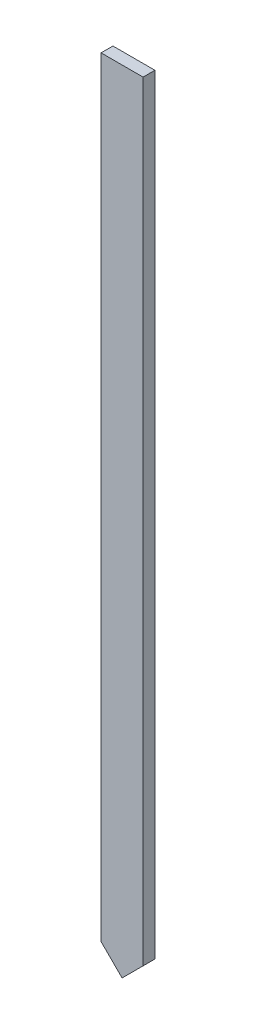
ISO-10303-21;
HEADER;
FILE_DESCRIPTION(('STEP AP214'),'2;1');
FILE_NAME('part.step','',(''),(''),'','','');
FILE_SCHEMA(('AUTOMOTIVE_DESIGN { 1 0 10303 214 1 1 1 1 }'));
ENDSEC;
DATA;
#1=APPLICATION_CONTEXT('core data for automotive mechanical design processes');
#2=APPLICATION_PROTOCOL_DEFINITION('international standard','automotive_design',2000,#1);
#3=PRODUCT_CONTEXT('',#1,'mechanical');
#4=PRODUCT('Part','Part','',(#3));
#5=PRODUCT_RELATED_PRODUCT_CATEGORY('part','',(#4));
#6=PRODUCT_DEFINITION_FORMATION('','',#4);
#7=PRODUCT_DEFINITION_CONTEXT('part definition',#1,'design');
#8=PRODUCT_DEFINITION('design','',#6,#7);
#9=PRODUCT_DEFINITION_SHAPE('','',#8);
#10=(LENGTH_UNIT() NAMED_UNIT(*) SI_UNIT(.MILLI.,.METRE.));
#11=(NAMED_UNIT(*) PLANE_ANGLE_UNIT() SI_UNIT($,.RADIAN.));
#12=(NAMED_UNIT(*) SI_UNIT($,.STERADIAN.) SOLID_ANGLE_UNIT());
#13=UNCERTAINTY_MEASURE_WITH_UNIT(LENGTH_MEASURE(1.E-05),#10,'distance_accuracy_value','');
#14=(GEOMETRIC_REPRESENTATION_CONTEXT(3) GLOBAL_UNCERTAINTY_ASSIGNED_CONTEXT((#13)) GLOBAL_UNIT_ASSIGNED_CONTEXT((#10,
#11,#12)) REPRESENTATION_CONTEXT('',''));
#15=CARTESIAN_POINT('',(0.,0.,0.));
#16=DIRECTION('',(0.,0.,1.));
#17=DIRECTION('',(1.,0.,0.));
#18=AXIS2_PLACEMENT_3D('',#15,#16,#17);
#19=CARTESIAN_POINT('',(0.41523702696564,-19.0419605138505,2.));
#20=DIRECTION('',(-1.,0.,0.));
#21=DIRECTION('',(0.,-1.,0.));
#22=AXIS2_PLACEMENT_3D('',#19,#20,#21);
#23=PLANE('',#22);
#24=DIRECTION('',(0.,1.,0.));
#25=VECTOR('',#24,1.);
#26=CARTESIAN_POINT('',(0.41523702696564,-19.0419605138505,0.));
#27=LINE('',#26,#25);
#28=CARTESIAN_POINT('',(0.41523702696564,-19.0419605138505,0.));
#29=VERTEX_POINT('',#28);
#30=CARTESIAN_POINT('',(0.415237026965624,110.91303948615,0.));
#31=VERTEX_POINT('',#30);
#32=EDGE_CURVE('E106',#29,#31,#27,.T.);
#33=ORIENTED_EDGE('',*,*,#32,.T.);
#34=DIRECTION('',(0.,0.,-1.));
#35=VECTOR('',#34,1.);
#36=CARTESIAN_POINT('',(0.415237026965624,110.91303948615,2.));
#37=LINE('',#36,#35);
#38=CARTESIAN_POINT('',(0.415237026965624,110.91303948615,2.));
#39=VERTEX_POINT('',#38);
#40=EDGE_CURVE('E11',#39,#31,#37,.T.);
#41=ORIENTED_EDGE('',*,*,#40,.F.);
#42=DIRECTION('',(0.,1.,0.));
#43=VECTOR('',#42,1.);
#44=CARTESIAN_POINT('',(0.41523702696564,-19.0419605138505,2.));
#45=LINE('',#44,#43);
#46=CARTESIAN_POINT('',(0.41523702696564,-19.0419605138505,2.));
#47=VERTEX_POINT('',#46);
#48=EDGE_CURVE('E114',#47,#39,#45,.T.);
#49=ORIENTED_EDGE('',*,*,#48,.F.);
#50=DIRECTION('',(0.,0.,-1.));
#51=VECTOR('',#50,1.);
#52=CARTESIAN_POINT('',(0.41523702696564,-19.0419605138505,2.));
#53=LINE('',#52,#51);
#54=EDGE_CURVE('E102',#47,#29,#53,.T.);
#55=ORIENTED_EDGE('',*,*,#54,.T.);
#56=EDGE_LOOP('',(#33,#41,#49,#55));
#57=FACE_BOUND('',#56,.T.);
#58=ADVANCED_FACE('F32',(#57),#23,.F.);
#59=CARTESIAN_POINT('',(0.415237026965624,110.91303948615,2.));
#60=DIRECTION('',(0.,-1.,0.));
#61=DIRECTION('',(0.,0.,-1.));
#62=AXIS2_PLACEMENT_3D('',#59,#60,#61);
#63=PLANE('',#62);
#64=DIRECTION('',(-1.,0.,0.));
#65=VECTOR('',#64,1.);
#66=CARTESIAN_POINT('',(0.415237026965624,110.91303948615,0.));
#67=LINE('',#66,#65);
#68=CARTESIAN_POINT('',(-6.67476297303438,110.91303948615,0.));
#69=VERTEX_POINT('',#68);
#70=EDGE_CURVE('E109',#31,#69,#67,.T.);
#71=ORIENTED_EDGE('',*,*,#70,.T.);
#72=DIRECTION('',(0.,0.,-1.));
#73=VECTOR('',#72,1.);
#74=CARTESIAN_POINT('',(-6.67476297303438,110.91303948615,2.));
#75=LINE('',#74,#73);
#76=CARTESIAN_POINT('',(-6.67476297303438,110.91303948615,2.));
#77=VERTEX_POINT('',#76);
#78=EDGE_CURVE('E40',#77,#69,#75,.T.);
#79=ORIENTED_EDGE('',*,*,#78,.F.);
#80=DIRECTION('',(-1.,0.,0.));
#81=VECTOR('',#80,1.);
#82=CARTESIAN_POINT('',(0.415237026965624,110.91303948615,2.));
#83=LINE('',#82,#81);
#84=EDGE_CURVE('E82',#39,#77,#83,.T.);
#85=ORIENTED_EDGE('',*,*,#84,.F.);
#86=ORIENTED_EDGE('',*,*,#40,.T.);
#87=EDGE_LOOP('',(#71,#79,#85,#86));
#88=FACE_BOUND('',#87,.T.);
#89=ADVANCED_FACE('F133',(#88),#63,.F.);
#90=CARTESIAN_POINT('',(-6.67476297303436,-19.0419605138505,2.));
#91=DIRECTION('',(1.,0.,0.));
#92=DIRECTION('',(0.,1.,0.));
#93=AXIS2_PLACEMENT_3D('',#90,#91,#92);
#94=PLANE('',#93);
#95=DIRECTION('',(0.,-1.,0.));
#96=VECTOR('',#95,1.);
#97=CARTESIAN_POINT('',(-6.67476297303436,-19.0419605138505,0.));
#98=LINE('',#97,#96);
#99=CARTESIAN_POINT('',(-6.67476297303436,-19.0419605138505,0.));
#100=VERTEX_POINT('',#99);
#101=EDGE_CURVE('E97',#69,#100,#98,.T.);
#102=ORIENTED_EDGE('',*,*,#101,.T.);
#103=DIRECTION('',(0.,0.,-1.));
#104=VECTOR('',#103,1.);
#105=CARTESIAN_POINT('',(-6.67476297303436,-19.0419605138505,2.));
#106=LINE('',#105,#104);
#107=CARTESIAN_POINT('',(-6.67476297303436,-19.0419605138505,2.));
#108=VERTEX_POINT('',#107);
#109=EDGE_CURVE('E94',#108,#100,#106,.T.);
#110=ORIENTED_EDGE('',*,*,#109,.F.);
#111=DIRECTION('',(0.,-1.,0.));
#112=VECTOR('',#111,1.);
#113=CARTESIAN_POINT('',(-6.67476297303436,-19.0419605138505,2.));
#114=LINE('',#113,#112);
#115=EDGE_CURVE('E86',#77,#108,#114,.T.);
#116=ORIENTED_EDGE('',*,*,#115,.F.);
#117=ORIENTED_EDGE('',*,*,#78,.T.);
#118=EDGE_LOOP('',(#102,#110,#116,#117));
#119=FACE_BOUND('',#118,.T.);
#120=ADVANCED_FACE('F95',(#119),#94,.F.);
#121=CARTESIAN_POINT('',(-3.12976297303436,-22.5869605138505,2.));
#122=DIRECTION('',(0.707106781186545,0.70710678118655,0.));
#123=DIRECTION('',(-0.70710678118655,0.707106781186545,0.));
#124=AXIS2_PLACEMENT_3D('',#121,#122,#123);
#125=PLANE('',#124);
#126=DIRECTION('',(0.70710678118655,-0.707106781186545,0.));
#127=VECTOR('',#126,1.);
#128=CARTESIAN_POINT('',(-3.12976297303436,-22.5869605138505,0.));
#129=LINE('',#128,#127);
#130=CARTESIAN_POINT('',(-3.12976297303436,-22.5869605138505,0.));
#131=VERTEX_POINT('',#130);
#132=EDGE_CURVE('E68',#100,#131,#129,.T.);
#133=ORIENTED_EDGE('',*,*,#132,.T.);
#134=DIRECTION('',(0.,0.,-1.));
#135=VECTOR('',#134,1.);
#136=CARTESIAN_POINT('',(-3.12976297303436,-22.5869605138505,2.));
#137=LINE('',#136,#135);
#138=CARTESIAN_POINT('',(-3.12976297303436,-22.5869605138505,2.));
#139=VERTEX_POINT('',#138);
#140=EDGE_CURVE('E98',#139,#131,#137,.T.);
#141=ORIENTED_EDGE('',*,*,#140,.F.);
#142=DIRECTION('',(0.70710678118655,-0.707106781186545,0.));
#143=VECTOR('',#142,1.);
#144=CARTESIAN_POINT('',(-3.12976297303436,-22.5869605138505,2.));
#145=LINE('',#144,#143);
#146=EDGE_CURVE('E90',#108,#139,#145,.T.);
#147=ORIENTED_EDGE('',*,*,#146,.F.);
#148=ORIENTED_EDGE('',*,*,#109,.T.);
#149=EDGE_LOOP('',(#133,#141,#147,#148));
#150=FACE_BOUND('',#149,.T.);
#151=ADVANCED_FACE('F100',(#150),#125,.F.);
#152=CARTESIAN_POINT('',(-3.12976297303436,-22.5869605138505,2.));
#153=DIRECTION('',(-0.707106781186551,0.707106781186545,0.));
#154=DIRECTION('',(-0.707106781186545,-0.707106781186551,0.));
#155=AXIS2_PLACEMENT_3D('',#152,#153,#154);
#156=PLANE('',#155);
#157=DIRECTION('',(0.707106781186545,0.707106781186551,0.));
#158=VECTOR('',#157,1.);
#159=CARTESIAN_POINT('',(-3.12976297303436,-22.5869605138505,0.));
#160=LINE('',#159,#158);
#161=EDGE_CURVE('E74',#131,#29,#160,.T.);
#162=ORIENTED_EDGE('',*,*,#161,.T.);
#163=ORIENTED_EDGE('',*,*,#54,.F.);
#164=DIRECTION('',(0.707106781186545,0.707106781186551,0.));
#165=VECTOR('',#164,1.);
#166=CARTESIAN_POINT('',(-3.12976297303436,-22.5869605138505,2.));
#167=LINE('',#166,#165);
#168=EDGE_CURVE('E48',#139,#47,#167,.T.);
#169=ORIENTED_EDGE('',*,*,#168,.F.);
#170=ORIENTED_EDGE('',*,*,#140,.T.);
#171=EDGE_LOOP('',(#162,#163,#169,#170));
#172=FACE_BOUND('',#171,.T.);
#173=ADVANCED_FACE('F122',(#172),#156,.F.);
#174=CARTESIAN_POINT('',(0.,0.,2.));
#175=DIRECTION('',(0.,0.,1.));
#176=DIRECTION('',(1.,0.,0.));
#177=AXIS2_PLACEMENT_3D('',#174,#175,#176);
#178=PLANE('',#177);
#179=ORIENTED_EDGE('',*,*,#48,.T.);
#180=ORIENTED_EDGE('',*,*,#84,.T.);
#181=ORIENTED_EDGE('',*,*,#115,.T.);
#182=ORIENTED_EDGE('',*,*,#146,.T.);
#183=ORIENTED_EDGE('',*,*,#168,.T.);
#184=EDGE_LOOP('',(#179,#180,#181,#182,#183));
#185=FACE_BOUND('',#184,.T.);
#186=ADVANCED_FACE('F88',(#185),#178,.T.);
#187=CARTESIAN_POINT('',(0.,0.,0.));
#188=DIRECTION('',(0.,0.,1.));
#189=DIRECTION('',(1.,0.,0.));
#190=AXIS2_PLACEMENT_3D('',#187,#188,#189);
#191=PLANE('',#190);
#192=ORIENTED_EDGE('',*,*,#32,.F.);
#193=ORIENTED_EDGE('',*,*,#161,.F.);
#194=ORIENTED_EDGE('',*,*,#132,.F.);
#195=ORIENTED_EDGE('',*,*,#101,.F.);
#196=ORIENTED_EDGE('',*,*,#70,.F.);
#197=EDGE_LOOP('',(#192,#193,#194,#195,#196));
#198=FACE_BOUND('',#197,.T.);
#199=ADVANCED_FACE('F118',(#198),#191,.F.);
#200=CLOSED_SHELL('',(#58,#89,#120,#151,#173,#186,#199));
#201=MANIFOLD_SOLID_BREP('B2',#200);
#202=ADVANCED_BREP_SHAPE_REPRESENTATION('',(#18,#201),#14);
#203=SHAPE_DEFINITION_REPRESENTATION(#9,#202);
ENDSEC;
END-ISO-10303-21;
